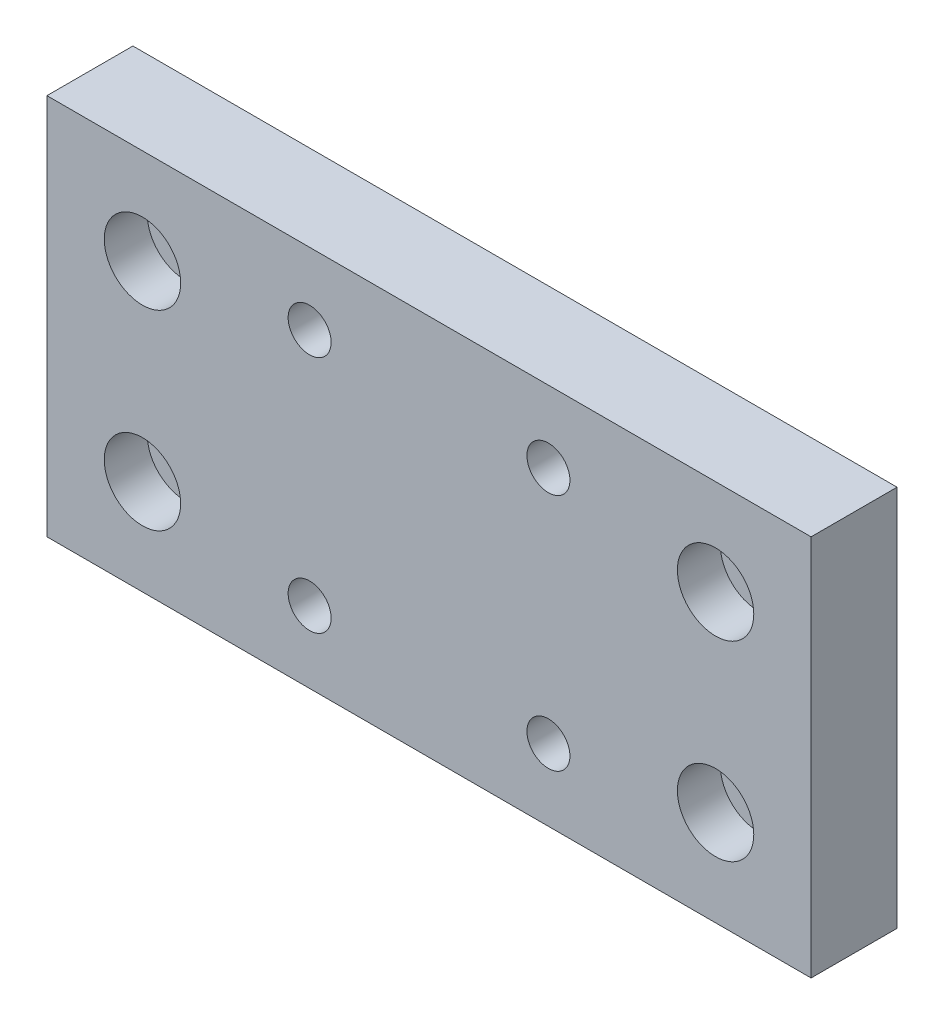
ISO-10303-21;
HEADER;
FILE_DESCRIPTION(('STEP AP214'),'2;1');
FILE_NAME('part.step','',(''),(''),'','','');
FILE_SCHEMA(('AUTOMOTIVE_DESIGN { 1 0 10303 214 1 1 1 1 }'));
ENDSEC;
DATA;
#1=APPLICATION_CONTEXT('core data for automotive mechanical design processes');
#2=APPLICATION_PROTOCOL_DEFINITION('international standard','automotive_design',2000,#1);
#3=PRODUCT_CONTEXT('',#1,'mechanical');
#4=PRODUCT('Part','Part','',(#3));
#5=PRODUCT_RELATED_PRODUCT_CATEGORY('part','',(#4));
#6=PRODUCT_DEFINITION_FORMATION('','',#4);
#7=PRODUCT_DEFINITION_CONTEXT('part definition',#1,'design');
#8=PRODUCT_DEFINITION('design','',#6,#7);
#9=PRODUCT_DEFINITION_SHAPE('','',#8);
#10=(LENGTH_UNIT() NAMED_UNIT(*) SI_UNIT(.MILLI.,.METRE.));
#11=(NAMED_UNIT(*) PLANE_ANGLE_UNIT() SI_UNIT($,.RADIAN.));
#12=(NAMED_UNIT(*) SI_UNIT($,.STERADIAN.) SOLID_ANGLE_UNIT());
#13=UNCERTAINTY_MEASURE_WITH_UNIT(LENGTH_MEASURE(1.E-05),#10,'distance_accuracy_value','');
#14=(GEOMETRIC_REPRESENTATION_CONTEXT(3) GLOBAL_UNCERTAINTY_ASSIGNED_CONTEXT((#13)) GLOBAL_UNIT_ASSIGNED_CONTEXT((#10,
#11,#12)) REPRESENTATION_CONTEXT('',''));
#15=CARTESIAN_POINT('',(0.,0.,0.));
#16=DIRECTION('',(0.,0.,1.));
#17=DIRECTION('',(1.,0.,0.));
#18=AXIS2_PLACEMENT_3D('',#15,#16,#17);
#19=CARTESIAN_POINT('',(-30.,-10.,9.));
#20=DIRECTION('',(0.,0.,-1.));
#21=DIRECTION('',(-1.,0.,0.));
#22=AXIS2_PLACEMENT_3D('',#19,#20,#21);
#23=CYLINDRICAL_SURFACE('',#22,2.25);
#24=CARTESIAN_POINT('',(-30.,-10.,0.));
#25=DIRECTION('',(0.,0.,-1.));
#26=DIRECTION('',(-1.,0.,0.));
#27=AXIS2_PLACEMENT_3D('',#24,#25,#26);
#28=CIRCLE('',#27,2.25);
#29=CARTESIAN_POINT('',(-32.25,-10.,0.));
#30=VERTEX_POINT('',#29);
#31=EDGE_CURVE('E216',#30,#30,#28,.T.);
#32=ORIENTED_EDGE('',*,*,#31,.T.);
#33=EDGE_LOOP('',(#32));
#34=FACE_BOUND('',#33,.T.);
#35=CARTESIAN_POINT('',(-30.,-10.,4.5));
#36=DIRECTION('',(0.,0.,1.));
#37=DIRECTION('',(1.,0.,0.));
#38=AXIS2_PLACEMENT_3D('',#35,#36,#37);
#39=CIRCLE('',#38,2.25);
#40=CARTESIAN_POINT('',(-27.75,-10.,4.5));
#41=VERTEX_POINT('',#40);
#42=EDGE_CURVE('E43',#41,#41,#39,.F.);
#43=ORIENTED_EDGE('',*,*,#42,.F.);
#44=EDGE_LOOP('',(#43));
#45=FACE_BOUND('',#44,.T.);
#46=ADVANCED_FACE('F39',(#34,#45),#23,.F.);
#47=CARTESIAN_POINT('',(-30.,10.,9.));
#48=DIRECTION('',(0.,0.,-1.));
#49=DIRECTION('',(-1.,0.,0.));
#50=AXIS2_PLACEMENT_3D('',#47,#48,#49);
#51=CYLINDRICAL_SURFACE('',#50,2.25);
#52=CARTESIAN_POINT('',(-30.,10.,0.));
#53=DIRECTION('',(0.,0.,-1.));
#54=DIRECTION('',(-1.,0.,0.));
#55=AXIS2_PLACEMENT_3D('',#52,#53,#54);
#56=CIRCLE('',#55,2.25);
#57=CARTESIAN_POINT('',(-32.25,10.,0.));
#58=VERTEX_POINT('',#57);
#59=EDGE_CURVE('E115',#58,#58,#56,.T.);
#60=ORIENTED_EDGE('',*,*,#59,.T.);
#61=EDGE_LOOP('',(#60));
#62=FACE_BOUND('',#61,.T.);
#63=CARTESIAN_POINT('',(-30.,10.,4.5));
#64=DIRECTION('',(0.,0.,1.));
#65=DIRECTION('',(1.,0.,0.));
#66=AXIS2_PLACEMENT_3D('',#63,#64,#65);
#67=CIRCLE('',#66,2.25);
#68=CARTESIAN_POINT('',(-27.75,10.,4.5));
#69=VERTEX_POINT('',#68);
#70=EDGE_CURVE('E152',#69,#69,#67,.F.);
#71=ORIENTED_EDGE('',*,*,#70,.F.);
#72=EDGE_LOOP('',(#71));
#73=FACE_BOUND('',#72,.T.);
#74=ADVANCED_FACE('F249',(#62,#73),#51,.F.);
#75=CARTESIAN_POINT('',(30.,-10.,9.));
#76=DIRECTION('',(0.,0.,-1.));
#77=DIRECTION('',(-1.,0.,0.));
#78=AXIS2_PLACEMENT_3D('',#75,#76,#77);
#79=CYLINDRICAL_SURFACE('',#78,2.25);
#80=CARTESIAN_POINT('',(30.,-10.,0.));
#81=DIRECTION('',(0.,0.,1.));
#82=DIRECTION('',(1.,0.,0.));
#83=AXIS2_PLACEMENT_3D('',#80,#81,#82);
#84=CIRCLE('',#83,2.25);
#85=CARTESIAN_POINT('',(32.25,-10.,0.));
#86=VERTEX_POINT('',#85);
#87=EDGE_CURVE('E208',#86,#86,#84,.T.);
#88=ORIENTED_EDGE('',*,*,#87,.F.);
#89=EDGE_LOOP('',(#88));
#90=FACE_BOUND('',#89,.T.);
#91=CARTESIAN_POINT('',(30.,-10.,4.5));
#92=DIRECTION('',(0.,0.,1.));
#93=DIRECTION('',(1.,0.,0.));
#94=AXIS2_PLACEMENT_3D('',#91,#92,#93);
#95=CIRCLE('',#94,2.25);
#96=CARTESIAN_POINT('',(32.25,-10.,4.5));
#97=VERTEX_POINT('',#96);
#98=EDGE_CURVE('E148',#97,#97,#95,.T.);
#99=ORIENTED_EDGE('',*,*,#98,.T.);
#100=EDGE_LOOP('',(#99));
#101=FACE_BOUND('',#100,.T.);
#102=ADVANCED_FACE('F254',(#90,#101),#79,.F.);
#103=CARTESIAN_POINT('',(30.,10.,9.));
#104=DIRECTION('',(0.,0.,-1.));
#105=DIRECTION('',(-1.,0.,0.));
#106=AXIS2_PLACEMENT_3D('',#103,#104,#105);
#107=CYLINDRICAL_SURFACE('',#106,2.25);
#108=CARTESIAN_POINT('',(30.,10.,0.));
#109=DIRECTION('',(0.,0.,1.));
#110=DIRECTION('',(1.,0.,0.));
#111=AXIS2_PLACEMENT_3D('',#108,#109,#110);
#112=CIRCLE('',#111,2.25);
#113=CARTESIAN_POINT('',(32.25,10.,0.));
#114=VERTEX_POINT('',#113);
#115=EDGE_CURVE('E212',#114,#114,#112,.T.);
#116=ORIENTED_EDGE('',*,*,#115,.F.);
#117=EDGE_LOOP('',(#116));
#118=FACE_BOUND('',#117,.T.);
#119=CARTESIAN_POINT('',(30.,10.,4.5));
#120=DIRECTION('',(0.,0.,1.));
#121=DIRECTION('',(1.,0.,0.));
#122=AXIS2_PLACEMENT_3D('',#119,#120,#121);
#123=CIRCLE('',#122,2.25);
#124=CARTESIAN_POINT('',(32.25,10.,4.5));
#125=VERTEX_POINT('',#124);
#126=EDGE_CURVE('E144',#125,#125,#123,.T.);
#127=ORIENTED_EDGE('',*,*,#126,.T.);
#128=EDGE_LOOP('',(#127));
#129=FACE_BOUND('',#128,.T.);
#130=ADVANCED_FACE('F260',(#118,#129),#107,.F.);
#131=CARTESIAN_POINT('',(-12.5,12.5,9.));
#132=DIRECTION('',(0.,0.,-1.));
#133=DIRECTION('',(-1.,0.,0.));
#134=AXIS2_PLACEMENT_3D('',#131,#132,#133);
#135=CYLINDRICAL_SURFACE('',#134,2.25);
#136=CARTESIAN_POINT('',(-12.5,12.5,9.));
#137=DIRECTION('',(0.,0.,-1.));
#138=DIRECTION('',(-1.,0.,0.));
#139=AXIS2_PLACEMENT_3D('',#136,#137,#138);
#140=CIRCLE('',#139,2.25);
#141=CARTESIAN_POINT('',(-14.75,12.5,9.));
#142=VERTEX_POINT('',#141);
#143=EDGE_CURVE('E200',#142,#142,#140,.T.);
#144=ORIENTED_EDGE('',*,*,#143,.F.);
#145=EDGE_LOOP('',(#144));
#146=FACE_BOUND('',#145,.T.);
#147=CARTESIAN_POINT('',(-12.5,12.5,4.5));
#148=DIRECTION('',(0.,0.,-1.));
#149=DIRECTION('',(-1.,0.,0.));
#150=AXIS2_PLACEMENT_3D('',#147,#148,#149);
#151=CIRCLE('',#150,2.25);
#152=CARTESIAN_POINT('',(-14.75,12.5,4.5));
#153=VERTEX_POINT('',#152);
#154=EDGE_CURVE('E139',#153,#153,#151,.F.);
#155=ORIENTED_EDGE('',*,*,#154,.F.);
#156=EDGE_LOOP('',(#155));
#157=FACE_BOUND('',#156,.T.);
#158=ADVANCED_FACE('F264',(#146,#157),#135,.F.);
#159=CARTESIAN_POINT('',(-12.5,-12.5,9.));
#160=DIRECTION('',(0.,0.,-1.));
#161=DIRECTION('',(-1.,0.,0.));
#162=AXIS2_PLACEMENT_3D('',#159,#160,#161);
#163=CYLINDRICAL_SURFACE('',#162,2.25);
#164=CARTESIAN_POINT('',(-12.5,-12.5,9.));
#165=DIRECTION('',(0.,0.,-1.));
#166=DIRECTION('',(-1.,0.,0.));
#167=AXIS2_PLACEMENT_3D('',#164,#165,#166);
#168=CIRCLE('',#167,2.25);
#169=CARTESIAN_POINT('',(-14.75,-12.5,9.));
#170=VERTEX_POINT('',#169);
#171=EDGE_CURVE('E204',#170,#170,#168,.T.);
#172=ORIENTED_EDGE('',*,*,#171,.F.);
#173=EDGE_LOOP('',(#172));
#174=FACE_BOUND('',#173,.T.);
#175=CARTESIAN_POINT('',(-12.5,-12.5,4.5));
#176=DIRECTION('',(0.,0.,-1.));
#177=DIRECTION('',(-1.,0.,0.));
#178=AXIS2_PLACEMENT_3D('',#175,#176,#177);
#179=CIRCLE('',#178,2.25);
#180=CARTESIAN_POINT('',(-14.75,-12.5,4.5));
#181=VERTEX_POINT('',#180);
#182=EDGE_CURVE('E135',#181,#181,#179,.F.);
#183=ORIENTED_EDGE('',*,*,#182,.F.);
#184=EDGE_LOOP('',(#183));
#185=FACE_BOUND('',#184,.T.);
#186=ADVANCED_FACE('F268',(#174,#185),#163,.F.);
#187=CARTESIAN_POINT('',(12.5,12.5,9.));
#188=DIRECTION('',(0.,0.,-1.));
#189=DIRECTION('',(-1.,0.,0.));
#190=AXIS2_PLACEMENT_3D('',#187,#188,#189);
#191=CYLINDRICAL_SURFACE('',#190,2.25);
#192=CARTESIAN_POINT('',(12.5,12.5,9.));
#193=DIRECTION('',(0.,0.,1.));
#194=DIRECTION('',(1.,0.,0.));
#195=AXIS2_PLACEMENT_3D('',#192,#193,#194);
#196=CIRCLE('',#195,2.25);
#197=CARTESIAN_POINT('',(14.75,12.5,9.));
#198=VERTEX_POINT('',#197);
#199=EDGE_CURVE('E143',#198,#198,#196,.T.);
#200=ORIENTED_EDGE('',*,*,#199,.T.);
#201=EDGE_LOOP('',(#200));
#202=FACE_BOUND('',#201,.T.);
#203=CARTESIAN_POINT('',(12.5,12.5,4.5));
#204=DIRECTION('',(0.,0.,-1.));
#205=DIRECTION('',(-1.,0.,0.));
#206=AXIS2_PLACEMENT_3D('',#203,#204,#205);
#207=CIRCLE('',#206,2.25);
#208=CARTESIAN_POINT('',(10.25,12.5,4.5));
#209=VERTEX_POINT('',#208);
#210=EDGE_CURVE('E130',#209,#209,#207,.T.);
#211=ORIENTED_EDGE('',*,*,#210,.T.);
#212=EDGE_LOOP('',(#211));
#213=FACE_BOUND('',#212,.T.);
#214=ADVANCED_FACE('F272',(#202,#213),#191,.F.);
#215=CARTESIAN_POINT('',(12.5,-12.5,9.));
#216=DIRECTION('',(0.,0.,-1.));
#217=DIRECTION('',(-1.,0.,0.));
#218=AXIS2_PLACEMENT_3D('',#215,#216,#217);
#219=CYLINDRICAL_SURFACE('',#218,2.25);
#220=CARTESIAN_POINT('',(12.5,-12.5,9.));
#221=DIRECTION('',(0.,0.,1.));
#222=DIRECTION('',(1.,0.,0.));
#223=AXIS2_PLACEMENT_3D('',#220,#221,#222);
#224=CIRCLE('',#223,2.25);
#225=CARTESIAN_POINT('',(14.75,-12.5,9.));
#226=VERTEX_POINT('',#225);
#227=EDGE_CURVE('E196',#226,#226,#224,.T.);
#228=ORIENTED_EDGE('',*,*,#227,.T.);
#229=EDGE_LOOP('',(#228));
#230=FACE_BOUND('',#229,.T.);
#231=CARTESIAN_POINT('',(12.5,-12.5,4.5));
#232=DIRECTION('',(0.,0.,-1.));
#233=DIRECTION('',(-1.,0.,0.));
#234=AXIS2_PLACEMENT_3D('',#231,#232,#233);
#235=CIRCLE('',#234,2.25);
#236=CARTESIAN_POINT('',(10.25,-12.5,4.5));
#237=VERTEX_POINT('',#236);
#238=EDGE_CURVE('E126',#237,#237,#235,.T.);
#239=ORIENTED_EDGE('',*,*,#238,.T.);
#240=EDGE_LOOP('',(#239));
#241=FACE_BOUND('',#240,.T.);
#242=ADVANCED_FACE('F276',(#230,#241),#219,.F.);
#243=CARTESIAN_POINT('',(40.,20.,9.));
#244=DIRECTION('',(-1.,0.,0.));
#245=DIRECTION('',(0.,0.,1.));
#246=AXIS2_PLACEMENT_3D('',#243,#244,#245);
#247=PLANE('',#246);
#248=DIRECTION('',(0.,1.,0.));
#249=VECTOR('',#248,1.);
#250=CARTESIAN_POINT('',(40.,20.,0.));
#251=LINE('',#250,#249);
#252=CARTESIAN_POINT('',(40.,-20.,0.));
#253=VERTEX_POINT('',#252);
#254=CARTESIAN_POINT('',(40.,20.,0.));
#255=VERTEX_POINT('',#254);
#256=EDGE_CURVE('E111',#253,#255,#251,.T.);
#257=ORIENTED_EDGE('',*,*,#256,.T.);
#258=DIRECTION('',(0.,0.,-1.));
#259=VECTOR('',#258,1.);
#260=CARTESIAN_POINT('',(40.,20.,9.));
#261=LINE('',#260,#259);
#262=CARTESIAN_POINT('',(40.,20.,9.));
#263=VERTEX_POINT('',#262);
#264=EDGE_CURVE('E11',#263,#255,#261,.T.);
#265=ORIENTED_EDGE('',*,*,#264,.F.);
#266=DIRECTION('',(0.,1.,0.));
#267=VECTOR('',#266,1.);
#268=CARTESIAN_POINT('',(40.,20.,9.));
#269=LINE('',#268,#267);
#270=CARTESIAN_POINT('',(40.,-20.,9.));
#271=VERTEX_POINT('',#270);
#272=EDGE_CURVE('E94',#271,#263,#269,.T.);
#273=ORIENTED_EDGE('',*,*,#272,.F.);
#274=DIRECTION('',(0.,0.,-1.));
#275=VECTOR('',#274,1.);
#276=CARTESIAN_POINT('',(40.,-20.,9.));
#277=LINE('',#276,#275);
#278=EDGE_CURVE('E107',#271,#253,#277,.T.);
#279=ORIENTED_EDGE('',*,*,#278,.T.);
#280=EDGE_LOOP('',(#257,#265,#273,#279));
#281=FACE_BOUND('',#280,.T.);
#282=ADVANCED_FACE('F41',(#281),#247,.F.);
#283=CARTESIAN_POINT('',(-40.,20.,9.));
#284=DIRECTION('',(0.,-1.,0.));
#285=DIRECTION('',(0.,0.,-1.));
#286=AXIS2_PLACEMENT_3D('',#283,#284,#285);
#287=PLANE('',#286);
#288=DIRECTION('',(-1.,0.,0.));
#289=VECTOR('',#288,1.);
#290=CARTESIAN_POINT('',(-40.,20.,0.));
#291=LINE('',#290,#289);
#292=CARTESIAN_POINT('',(-40.,20.,0.));
#293=VERTEX_POINT('',#292);
#294=EDGE_CURVE('E99',#255,#293,#291,.T.);
#295=ORIENTED_EDGE('',*,*,#294,.T.);
#296=DIRECTION('',(0.,0.,-1.));
#297=VECTOR('',#296,1.);
#298=CARTESIAN_POINT('',(-40.,20.,9.));
#299=LINE('',#298,#297);
#300=CARTESIAN_POINT('',(-40.,20.,9.));
#301=VERTEX_POINT('',#300);
#302=EDGE_CURVE('E50',#301,#293,#299,.T.);
#303=ORIENTED_EDGE('',*,*,#302,.F.);
#304=DIRECTION('',(-1.,0.,0.));
#305=VECTOR('',#304,1.);
#306=CARTESIAN_POINT('',(-40.,20.,9.));
#307=LINE('',#306,#305);
#308=EDGE_CURVE('E89',#263,#301,#307,.T.);
#309=ORIENTED_EDGE('',*,*,#308,.F.);
#310=ORIENTED_EDGE('',*,*,#264,.T.);
#311=EDGE_LOOP('',(#295,#303,#309,#310));
#312=FACE_BOUND('',#311,.T.);
#313=ADVANCED_FACE('F98',(#312),#287,.F.);
#314=CARTESIAN_POINT('',(-40.,20.,9.));
#315=DIRECTION('',(1.,0.,0.));
#316=DIRECTION('',(0.,0.,-1.));
#317=AXIS2_PLACEMENT_3D('',#314,#315,#316);
#318=PLANE('',#317);
#319=DIRECTION('',(0.,-1.,0.));
#320=VECTOR('',#319,1.);
#321=CARTESIAN_POINT('',(-40.,20.,0.));
#322=LINE('',#321,#320);
#323=CARTESIAN_POINT('',(-40.,-20.,0.));
#324=VERTEX_POINT('',#323);
#325=EDGE_CURVE('E76',#293,#324,#322,.T.);
#326=ORIENTED_EDGE('',*,*,#325,.T.);
#327=DIRECTION('',(0.,0.,-1.));
#328=VECTOR('',#327,1.);
#329=CARTESIAN_POINT('',(-40.,-20.,9.));
#330=LINE('',#329,#328);
#331=CARTESIAN_POINT('',(-40.,-20.,9.));
#332=VERTEX_POINT('',#331);
#333=EDGE_CURVE('E101',#332,#324,#330,.T.);
#334=ORIENTED_EDGE('',*,*,#333,.F.);
#335=DIRECTION('',(0.,-1.,0.));
#336=VECTOR('',#335,1.);
#337=CARTESIAN_POINT('',(-40.,20.,9.));
#338=LINE('',#337,#336);
#339=EDGE_CURVE('E92',#301,#332,#338,.T.);
#340=ORIENTED_EDGE('',*,*,#339,.F.);
#341=ORIENTED_EDGE('',*,*,#302,.T.);
#342=EDGE_LOOP('',(#326,#334,#340,#341));
#343=FACE_BOUND('',#342,.T.);
#344=ADVANCED_FACE('F103',(#343),#318,.F.);
#345=CARTESIAN_POINT('',(-40.,-20.,9.));
#346=DIRECTION('',(0.,1.,0.));
#347=DIRECTION('',(0.,0.,1.));
#348=AXIS2_PLACEMENT_3D('',#345,#346,#347);
#349=PLANE('',#348);
#350=DIRECTION('',(1.,0.,0.));
#351=VECTOR('',#350,1.);
#352=CARTESIAN_POINT('',(-40.,-20.,0.));
#353=LINE('',#352,#351);
#354=EDGE_CURVE('E82',#324,#253,#353,.T.);
#355=ORIENTED_EDGE('',*,*,#354,.T.);
#356=ORIENTED_EDGE('',*,*,#278,.F.);
#357=DIRECTION('',(1.,0.,0.));
#358=VECTOR('',#357,1.);
#359=CARTESIAN_POINT('',(-40.,-20.,9.));
#360=LINE('',#359,#358);
#361=EDGE_CURVE('E59',#332,#271,#360,.T.);
#362=ORIENTED_EDGE('',*,*,#361,.F.);
#363=ORIENTED_EDGE('',*,*,#333,.T.);
#364=EDGE_LOOP('',(#355,#356,#362,#363));
#365=FACE_BOUND('',#364,.T.);
#366=ADVANCED_FACE('F238',(#365),#349,.F.);
#367=CARTESIAN_POINT('',(0.,0.,9.));
#368=DIRECTION('',(0.,0.,1.));
#369=DIRECTION('',(1.,0.,0.));
#370=AXIS2_PLACEMENT_3D('',#367,#368,#369);
#371=PLANE('',#370);
#372=CARTESIAN_POINT('',(-30.,10.,9.));
#373=DIRECTION('',(0.,0.,1.));
#374=DIRECTION('',(1.,0.,0.));
#375=AXIS2_PLACEMENT_3D('',#372,#373,#374);
#376=CIRCLE('',#375,4.);
#377=CARTESIAN_POINT('',(-26.,10.,9.));
#378=VERTEX_POINT('',#377);
#379=EDGE_CURVE('E367',#378,#378,#376,.T.);
#380=ORIENTED_EDGE('',*,*,#379,.F.);
#381=EDGE_LOOP('',(#380));
#382=FACE_BOUND('',#381,.T.);
#383=CARTESIAN_POINT('',(30.,-10.,9.));
#384=DIRECTION('',(0.,0.,1.));
#385=DIRECTION('',(1.,0.,0.));
#386=AXIS2_PLACEMENT_3D('',#383,#384,#385);
#387=CIRCLE('',#386,4.00000000000001);
#388=CARTESIAN_POINT('',(34.,-10.,9.));
#389=VERTEX_POINT('',#388);
#390=EDGE_CURVE('E351',#389,#389,#387,.T.);
#391=ORIENTED_EDGE('',*,*,#390,.F.);
#392=EDGE_LOOP('',(#391));
#393=FACE_BOUND('',#392,.T.);
#394=CARTESIAN_POINT('',(30.,10.,9.));
#395=DIRECTION('',(0.,0.,1.));
#396=DIRECTION('',(1.,0.,0.));
#397=AXIS2_PLACEMENT_3D('',#394,#395,#396);
#398=CIRCLE('',#397,4.00000000000001);
#399=CARTESIAN_POINT('',(34.,10.,9.));
#400=VERTEX_POINT('',#399);
#401=EDGE_CURVE('E352',#400,#400,#398,.T.);
#402=ORIENTED_EDGE('',*,*,#401,.F.);
#403=EDGE_LOOP('',(#402));
#404=FACE_BOUND('',#403,.T.);
#405=CARTESIAN_POINT('',(-30.,-10.,9.));
#406=DIRECTION('',(0.,0.,1.));
#407=DIRECTION('',(1.,0.,0.));
#408=AXIS2_PLACEMENT_3D('',#405,#406,#407);
#409=CIRCLE('',#408,4.);
#410=CARTESIAN_POINT('',(-26.,-10.,9.));
#411=VERTEX_POINT('',#410);
#412=EDGE_CURVE('E366',#411,#411,#409,.T.);
#413=ORIENTED_EDGE('',*,*,#412,.F.);
#414=EDGE_LOOP('',(#413));
#415=FACE_BOUND('',#414,.T.);
#416=ORIENTED_EDGE('',*,*,#227,.F.);
#417=EDGE_LOOP('',(#416));
#418=FACE_BOUND('',#417,.T.);
#419=ORIENTED_EDGE('',*,*,#199,.F.);
#420=EDGE_LOOP('',(#419));
#421=FACE_BOUND('',#420,.T.);
#422=ORIENTED_EDGE('',*,*,#171,.T.);
#423=EDGE_LOOP('',(#422));
#424=FACE_BOUND('',#423,.T.);
#425=ORIENTED_EDGE('',*,*,#143,.T.);
#426=EDGE_LOOP('',(#425));
#427=FACE_BOUND('',#426,.T.);
#428=ORIENTED_EDGE('',*,*,#272,.T.);
#429=ORIENTED_EDGE('',*,*,#308,.T.);
#430=ORIENTED_EDGE('',*,*,#339,.T.);
#431=ORIENTED_EDGE('',*,*,#361,.T.);
#432=EDGE_LOOP('',(#428,#429,#430,#431));
#433=FACE_BOUND('',#432,.T.);
#434=ADVANCED_FACE('F90',(#382,#393,#404,#415,#418,#421,#424,#427,#433),#371,.T.);
#435=CARTESIAN_POINT('',(0.,0.,0.));
#436=DIRECTION('',(0.,0.,1.));
#437=DIRECTION('',(1.,0.,0.));
#438=AXIS2_PLACEMENT_3D('',#435,#436,#437);
#439=PLANE('',#438);
#440=CARTESIAN_POINT('',(-12.5,-12.5,0.));
#441=DIRECTION('',(0.,0.,-1.));
#442=DIRECTION('',(-1.,0.,0.));
#443=AXIS2_PLACEMENT_3D('',#440,#441,#442);
#444=CIRCLE('',#443,4.);
#445=CARTESIAN_POINT('',(-16.5,-12.5,0.));
#446=VERTEX_POINT('',#445);
#447=EDGE_CURVE('E179',#446,#446,#444,.T.);
#448=ORIENTED_EDGE('',*,*,#447,.F.);
#449=EDGE_LOOP('',(#448));
#450=FACE_BOUND('',#449,.T.);
#451=CARTESIAN_POINT('',(12.5,12.5,0.));
#452=DIRECTION('',(0.,0.,-1.));
#453=DIRECTION('',(-1.,0.,0.));
#454=AXIS2_PLACEMENT_3D('',#451,#452,#453);
#455=CIRCLE('',#454,4.);
#456=CARTESIAN_POINT('',(8.50000000000001,12.5,0.));
#457=VERTEX_POINT('',#456);
#458=EDGE_CURVE('E170',#457,#457,#455,.T.);
#459=ORIENTED_EDGE('',*,*,#458,.F.);
#460=EDGE_LOOP('',(#459));
#461=FACE_BOUND('',#460,.T.);
#462=CARTESIAN_POINT('',(12.5,-12.5,0.));
#463=DIRECTION('',(0.,0.,-1.));
#464=DIRECTION('',(-1.,0.,0.));
#465=AXIS2_PLACEMENT_3D('',#462,#463,#464);
#466=CIRCLE('',#465,4.);
#467=CARTESIAN_POINT('',(8.50000000000001,-12.5,0.));
#468=VERTEX_POINT('',#467);
#469=EDGE_CURVE('E159',#468,#468,#466,.T.);
#470=ORIENTED_EDGE('',*,*,#469,.F.);
#471=EDGE_LOOP('',(#470));
#472=FACE_BOUND('',#471,.T.);
#473=CARTESIAN_POINT('',(-12.5,12.5,0.));
#474=DIRECTION('',(0.,0.,-1.));
#475=DIRECTION('',(-1.,0.,0.));
#476=AXIS2_PLACEMENT_3D('',#473,#474,#475);
#477=CIRCLE('',#476,4.);
#478=CARTESIAN_POINT('',(-16.5,12.5,0.));
#479=VERTEX_POINT('',#478);
#480=EDGE_CURVE('E178',#479,#479,#477,.T.);
#481=ORIENTED_EDGE('',*,*,#480,.F.);
#482=EDGE_LOOP('',(#481));
#483=FACE_BOUND('',#482,.T.);
#484=ORIENTED_EDGE('',*,*,#115,.T.);
#485=EDGE_LOOP('',(#484));
#486=FACE_BOUND('',#485,.T.);
#487=ORIENTED_EDGE('',*,*,#87,.T.);
#488=EDGE_LOOP('',(#487));
#489=FACE_BOUND('',#488,.T.);
#490=ORIENTED_EDGE('',*,*,#59,.F.);
#491=EDGE_LOOP('',(#490));
#492=FACE_BOUND('',#491,.T.);
#493=ORIENTED_EDGE('',*,*,#31,.F.);
#494=EDGE_LOOP('',(#493));
#495=FACE_BOUND('',#494,.T.);
#496=ORIENTED_EDGE('',*,*,#256,.F.);
#497=ORIENTED_EDGE('',*,*,#354,.F.);
#498=ORIENTED_EDGE('',*,*,#325,.F.);
#499=ORIENTED_EDGE('',*,*,#294,.F.);
#500=EDGE_LOOP('',(#496,#497,#498,#499));
#501=FACE_BOUND('',#500,.T.);
#502=ADVANCED_FACE('F230',(#450,#461,#472,#483,#486,#489,#492,#495,#501),#439,.F.);
#503=CARTESIAN_POINT('',(12.5,-12.5,4.5));
#504=DIRECTION('',(0.,0.,-1.));
#505=DIRECTION('',(-1.,0.,0.));
#506=AXIS2_PLACEMENT_3D('',#503,#504,#505);
#507=CYLINDRICAL_SURFACE('',#506,4.);
#508=CARTESIAN_POINT('',(12.5,-12.5,4.5));
#509=DIRECTION('',(0.,0.,-1.));
#510=DIRECTION('',(-1.,0.,0.));
#511=AXIS2_PLACEMENT_3D('',#508,#509,#510);
#512=CIRCLE('',#511,4.);
#513=CARTESIAN_POINT('',(8.50000000000001,-12.5,4.5));
#514=VERTEX_POINT('',#513);
#515=EDGE_CURVE('E164',#514,#514,#512,.T.);
#516=ORIENTED_EDGE('',*,*,#515,.F.);
#517=EDGE_LOOP('',(#516));
#518=FACE_BOUND('',#517,.T.);
#519=ORIENTED_EDGE('',*,*,#469,.T.);
#520=EDGE_LOOP('',(#519));
#521=FACE_BOUND('',#520,.T.);
#522=ADVANCED_FACE('F233',(#518,#521),#507,.F.);
#523=CARTESIAN_POINT('',(12.5,-12.5,4.5));
#524=DIRECTION('',(0.,0.,-1.));
#525=DIRECTION('',(-1.,0.,0.));
#526=AXIS2_PLACEMENT_3D('',#523,#524,#525);
#527=PLANE('',#526);
#528=ORIENTED_EDGE('',*,*,#238,.F.);
#529=EDGE_LOOP('',(#528));
#530=FACE_BOUND('',#529,.T.);
#531=ORIENTED_EDGE('',*,*,#515,.T.);
#532=EDGE_LOOP('',(#531));
#533=FACE_BOUND('',#532,.T.);
#534=ADVANCED_FACE('F295',(#530,#533),#527,.T.);
#535=CARTESIAN_POINT('',(12.5,12.5,4.5));
#536=DIRECTION('',(0.,0.,-1.));
#537=DIRECTION('',(-1.,0.,0.));
#538=AXIS2_PLACEMENT_3D('',#535,#536,#537);
#539=CYLINDRICAL_SURFACE('',#538,4.);
#540=CARTESIAN_POINT('',(12.5,12.5,4.5));
#541=DIRECTION('',(0.,0.,-1.));
#542=DIRECTION('',(-1.,0.,0.));
#543=AXIS2_PLACEMENT_3D('',#540,#541,#542);
#544=CIRCLE('',#543,4.);
#545=CARTESIAN_POINT('',(8.50000000000001,12.5,4.5));
#546=VERTEX_POINT('',#545);
#547=EDGE_CURVE('E183',#546,#546,#544,.T.);
#548=ORIENTED_EDGE('',*,*,#547,.F.);
#549=EDGE_LOOP('',(#548));
#550=FACE_BOUND('',#549,.T.);
#551=ORIENTED_EDGE('',*,*,#458,.T.);
#552=EDGE_LOOP('',(#551));
#553=FACE_BOUND('',#552,.T.);
#554=ADVANCED_FACE('F291',(#550,#553),#539,.F.);
#555=CARTESIAN_POINT('',(12.5,12.5,4.5));
#556=DIRECTION('',(0.,0.,-1.));
#557=DIRECTION('',(-1.,0.,0.));
#558=AXIS2_PLACEMENT_3D('',#555,#556,#557);
#559=PLANE('',#558);
#560=ORIENTED_EDGE('',*,*,#210,.F.);
#561=EDGE_LOOP('',(#560));
#562=FACE_BOUND('',#561,.T.);
#563=ORIENTED_EDGE('',*,*,#547,.T.);
#564=EDGE_LOOP('',(#563));
#565=FACE_BOUND('',#564,.T.);
#566=ADVANCED_FACE('F294',(#562,#565),#559,.T.);
#567=CARTESIAN_POINT('',(-12.5,-12.5,4.5));
#568=DIRECTION('',(0.,0.,-1.));
#569=DIRECTION('',(-1.,0.,0.));
#570=AXIS2_PLACEMENT_3D('',#567,#568,#569);
#571=PLANE('',#570);
#572=CARTESIAN_POINT('',(-12.5,-12.5,4.5));
#573=DIRECTION('',(0.,0.,-1.));
#574=DIRECTION('',(-1.,0.,0.));
#575=AXIS2_PLACEMENT_3D('',#572,#573,#574);
#576=CIRCLE('',#575,4.);
#577=CARTESIAN_POINT('',(-16.5,-12.5,4.5));
#578=VERTEX_POINT('',#577);
#579=EDGE_CURVE('E174',#578,#578,#576,.T.);
#580=ORIENTED_EDGE('',*,*,#579,.T.);
#581=EDGE_LOOP('',(#580));
#582=FACE_BOUND('',#581,.T.);
#583=ORIENTED_EDGE('',*,*,#182,.T.);
#584=EDGE_LOOP('',(#583));
#585=FACE_BOUND('',#584,.T.);
#586=ADVANCED_FACE('F299',(#582,#585),#571,.T.);
#587=CARTESIAN_POINT('',(-12.5,-12.5,4.5));
#588=DIRECTION('',(0.,0.,-1.));
#589=DIRECTION('',(-1.,0.,0.));
#590=AXIS2_PLACEMENT_3D('',#587,#588,#589);
#591=CYLINDRICAL_SURFACE('',#590,4.);
#592=ORIENTED_EDGE('',*,*,#579,.F.);
#593=EDGE_LOOP('',(#592));
#594=FACE_BOUND('',#593,.T.);
#595=ORIENTED_EDGE('',*,*,#447,.T.);
#596=EDGE_LOOP('',(#595));
#597=FACE_BOUND('',#596,.T.);
#598=ADVANCED_FACE('F289',(#594,#597),#591,.F.);
#599=CARTESIAN_POINT('',(-12.5,12.5,4.5));
#600=DIRECTION('',(0.,0.,-1.));
#601=DIRECTION('',(-1.,0.,0.));
#602=AXIS2_PLACEMENT_3D('',#599,#600,#601);
#603=PLANE('',#602);
#604=CARTESIAN_POINT('',(-12.5,12.5,4.5));
#605=DIRECTION('',(0.,0.,-1.));
#606=DIRECTION('',(-1.,0.,0.));
#607=AXIS2_PLACEMENT_3D('',#604,#605,#606);
#608=CIRCLE('',#607,4.);
#609=CARTESIAN_POINT('',(-16.5,12.5,4.5));
#610=VERTEX_POINT('',#609);
#611=EDGE_CURVE('E131',#610,#610,#608,.T.);
#612=ORIENTED_EDGE('',*,*,#611,.T.);
#613=EDGE_LOOP('',(#612));
#614=FACE_BOUND('',#613,.T.);
#615=ORIENTED_EDGE('',*,*,#154,.T.);
#616=EDGE_LOOP('',(#615));
#617=FACE_BOUND('',#616,.T.);
#618=ADVANCED_FACE('F285',(#614,#617),#603,.T.);
#619=CARTESIAN_POINT('',(-12.5,12.5,4.5));
#620=DIRECTION('',(0.,0.,-1.));
#621=DIRECTION('',(-1.,0.,0.));
#622=AXIS2_PLACEMENT_3D('',#619,#620,#621);
#623=CYLINDRICAL_SURFACE('',#622,4.);
#624=ORIENTED_EDGE('',*,*,#611,.F.);
#625=EDGE_LOOP('',(#624));
#626=FACE_BOUND('',#625,.T.);
#627=ORIENTED_EDGE('',*,*,#480,.T.);
#628=EDGE_LOOP('',(#627));
#629=FACE_BOUND('',#628,.T.);
#630=ADVANCED_FACE('F281',(#626,#629),#623,.F.);
#631=CARTESIAN_POINT('',(30.,10.,4.5));
#632=DIRECTION('',(0.,0.,1.));
#633=DIRECTION('',(1.,0.,0.));
#634=AXIS2_PLACEMENT_3D('',#631,#632,#633);
#635=CYLINDRICAL_SURFACE('',#634,4.00000000000001);
#636=CARTESIAN_POINT('',(30.,10.,4.5));
#637=DIRECTION('',(0.,0.,1.));
#638=DIRECTION('',(1.,0.,0.));
#639=AXIS2_PLACEMENT_3D('',#636,#637,#638);
#640=CIRCLE('',#639,4.00000000000001);
#641=CARTESIAN_POINT('',(34.,10.,4.5));
#642=VERTEX_POINT('',#641);
#643=EDGE_CURVE('E349',#642,#642,#640,.T.);
#644=ORIENTED_EDGE('',*,*,#643,.F.);
#645=EDGE_LOOP('',(#644));
#646=FACE_BOUND('',#645,.T.);
#647=ORIENTED_EDGE('',*,*,#401,.T.);
#648=EDGE_LOOP('',(#647));
#649=FACE_BOUND('',#648,.T.);
#650=ADVANCED_FACE('F284',(#646,#649),#635,.F.);
#651=CARTESIAN_POINT('',(30.,10.,4.5));
#652=DIRECTION('',(0.,0.,1.));
#653=DIRECTION('',(1.,0.,0.));
#654=AXIS2_PLACEMENT_3D('',#651,#652,#653);
#655=PLANE('',#654);
#656=ORIENTED_EDGE('',*,*,#126,.F.);
#657=EDGE_LOOP('',(#656));
#658=FACE_BOUND('',#657,.T.);
#659=ORIENTED_EDGE('',*,*,#643,.T.);
#660=EDGE_LOOP('',(#659));
#661=FACE_BOUND('',#660,.T.);
#662=ADVANCED_FACE('F326',(#658,#661),#655,.T.);
#663=CARTESIAN_POINT('',(30.,-10.,4.5));
#664=DIRECTION('',(0.,0.,1.));
#665=DIRECTION('',(1.,0.,0.));
#666=AXIS2_PLACEMENT_3D('',#663,#664,#665);
#667=CYLINDRICAL_SURFACE('',#666,4.00000000000001);
#668=CARTESIAN_POINT('',(30.,-10.,4.5));
#669=DIRECTION('',(0.,0.,1.));
#670=DIRECTION('',(1.,0.,0.));
#671=AXIS2_PLACEMENT_3D('',#668,#669,#670);
#672=CIRCLE('',#671,4.00000000000001);
#673=CARTESIAN_POINT('',(34.,-10.,4.5));
#674=VERTEX_POINT('',#673);
#675=EDGE_CURVE('E357',#674,#674,#672,.T.);
#676=ORIENTED_EDGE('',*,*,#675,.F.);
#677=EDGE_LOOP('',(#676));
#678=FACE_BOUND('',#677,.T.);
#679=ORIENTED_EDGE('',*,*,#390,.T.);
#680=EDGE_LOOP('',(#679));
#681=FACE_BOUND('',#680,.T.);
#682=ADVANCED_FACE('F322',(#678,#681),#667,.F.);
#683=CARTESIAN_POINT('',(30.,-10.,4.5));
#684=DIRECTION('',(0.,0.,1.));
#685=DIRECTION('',(1.,0.,0.));
#686=AXIS2_PLACEMENT_3D('',#683,#684,#685);
#687=PLANE('',#686);
#688=ORIENTED_EDGE('',*,*,#98,.F.);
#689=EDGE_LOOP('',(#688));
#690=FACE_BOUND('',#689,.T.);
#691=ORIENTED_EDGE('',*,*,#675,.T.);
#692=EDGE_LOOP('',(#691));
#693=FACE_BOUND('',#692,.T.);
#694=ADVANCED_FACE('F325',(#690,#693),#687,.T.);
#695=CARTESIAN_POINT('',(-30.,10.,4.5));
#696=DIRECTION('',(0.,0.,1.));
#697=DIRECTION('',(1.,0.,0.));
#698=AXIS2_PLACEMENT_3D('',#695,#696,#697);
#699=PLANE('',#698);
#700=CARTESIAN_POINT('',(-30.,10.,4.5));
#701=DIRECTION('',(0.,0.,1.));
#702=DIRECTION('',(1.,0.,0.));
#703=AXIS2_PLACEMENT_3D('',#700,#701,#702);
#704=CIRCLE('',#703,4.);
#705=CARTESIAN_POINT('',(-26.,10.,4.5));
#706=VERTEX_POINT('',#705);
#707=EDGE_CURVE('E362',#706,#706,#704,.T.);
#708=ORIENTED_EDGE('',*,*,#707,.T.);
#709=EDGE_LOOP('',(#708));
#710=FACE_BOUND('',#709,.T.);
#711=ORIENTED_EDGE('',*,*,#70,.T.);
#712=EDGE_LOOP('',(#711));
#713=FACE_BOUND('',#712,.T.);
#714=ADVANCED_FACE('F330',(#710,#713),#699,.T.);
#715=CARTESIAN_POINT('',(-30.,10.,4.5));
#716=DIRECTION('',(0.,0.,1.));
#717=DIRECTION('',(1.,0.,0.));
#718=AXIS2_PLACEMENT_3D('',#715,#716,#717);
#719=CYLINDRICAL_SURFACE('',#718,4.);
#720=ORIENTED_EDGE('',*,*,#707,.F.);
#721=EDGE_LOOP('',(#720));
#722=FACE_BOUND('',#721,.T.);
#723=ORIENTED_EDGE('',*,*,#379,.T.);
#724=EDGE_LOOP('',(#723));
#725=FACE_BOUND('',#724,.T.);
#726=ADVANCED_FACE('F320',(#722,#725),#719,.F.);
#727=CARTESIAN_POINT('',(-30.,-10.,4.5));
#728=DIRECTION('',(0.,0.,1.));
#729=DIRECTION('',(1.,0.,0.));
#730=AXIS2_PLACEMENT_3D('',#727,#728,#729);
#731=PLANE('',#730);
#732=CARTESIAN_POINT('',(-30.,-10.,4.5));
#733=DIRECTION('',(0.,0.,1.));
#734=DIRECTION('',(1.,0.,0.));
#735=AXIS2_PLACEMENT_3D('',#732,#733,#734);
#736=CIRCLE('',#735,4.);
#737=CARTESIAN_POINT('',(-26.,-10.,4.5));
#738=VERTEX_POINT('',#737);
#739=EDGE_CURVE('E149',#738,#738,#736,.T.);
#740=ORIENTED_EDGE('',*,*,#739,.T.);
#741=EDGE_LOOP('',(#740));
#742=FACE_BOUND('',#741,.T.);
#743=ORIENTED_EDGE('',*,*,#42,.T.);
#744=EDGE_LOOP('',(#743));
#745=FACE_BOUND('',#744,.T.);
#746=ADVANCED_FACE('F316',(#742,#745),#731,.T.);
#747=CARTESIAN_POINT('',(-30.,-10.,4.5));
#748=DIRECTION('',(0.,0.,1.));
#749=DIRECTION('',(1.,0.,0.));
#750=AXIS2_PLACEMENT_3D('',#747,#748,#749);
#751=CYLINDRICAL_SURFACE('',#750,4.);
#752=ORIENTED_EDGE('',*,*,#739,.F.);
#753=EDGE_LOOP('',(#752));
#754=FACE_BOUND('',#753,.T.);
#755=ORIENTED_EDGE('',*,*,#412,.T.);
#756=EDGE_LOOP('',(#755));
#757=FACE_BOUND('',#756,.T.);
#758=ADVANCED_FACE('F313',(#754,#757),#751,.F.);
#759=CLOSED_SHELL('',(#46,#74,#102,#130,#158,#186,#214,#242,#282,#313,#344,#366,#434,#502,#522,
#534,#554,#566,#586,#598,#618,#630,#650,#662,#682,#694,#714,#726,#746,#758));
#760=MANIFOLD_SOLID_BREP('B2',#759);
#761=ADVANCED_BREP_SHAPE_REPRESENTATION('',(#18,#760),#14);
#762=SHAPE_DEFINITION_REPRESENTATION(#9,#761);
ENDSEC;
END-ISO-10303-21;
